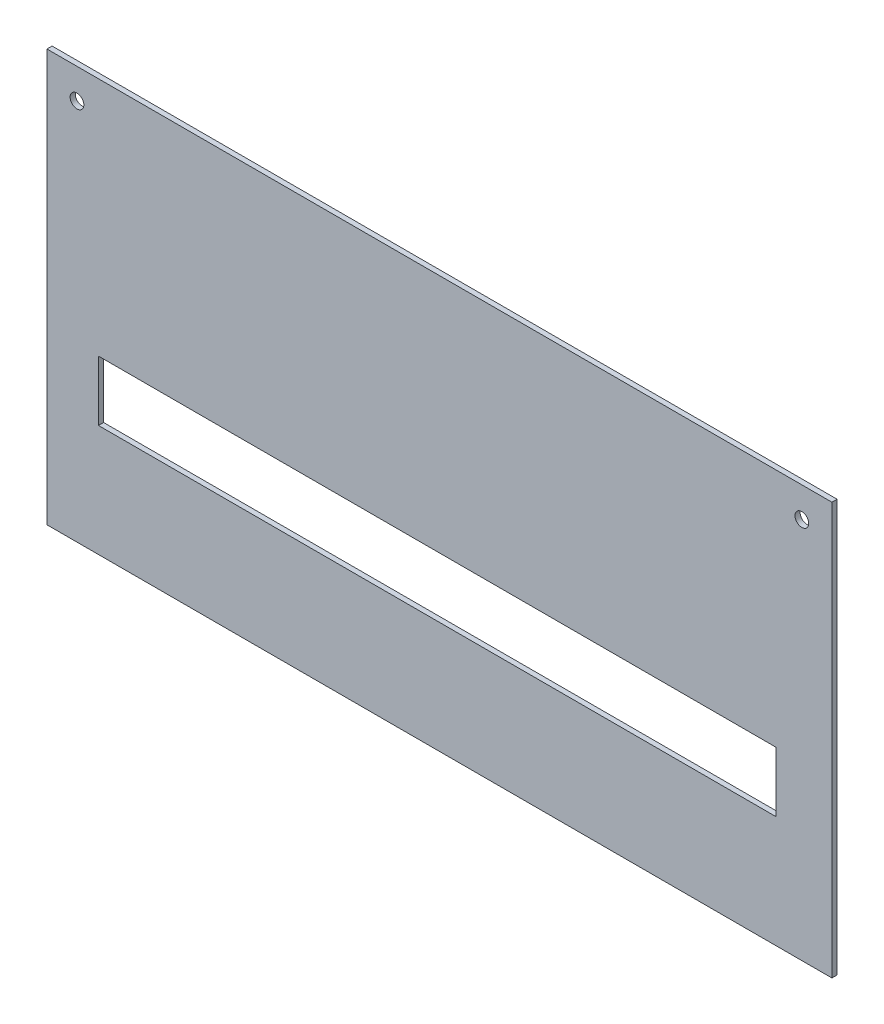
ISO-10303-21;
HEADER;
FILE_DESCRIPTION(('STEP AP214'),'2;1');
FILE_NAME('part.step','',(''),(''),'','','');
FILE_SCHEMA(('AUTOMOTIVE_DESIGN { 1 0 10303 214 1 1 1 1 }'));
ENDSEC;
DATA;
#1=APPLICATION_CONTEXT('core data for automotive mechanical design processes');
#2=APPLICATION_PROTOCOL_DEFINITION('international standard','automotive_design',2000,#1);
#3=PRODUCT_CONTEXT('',#1,'mechanical');
#4=PRODUCT('Part','Part','',(#3));
#5=PRODUCT_RELATED_PRODUCT_CATEGORY('part','',(#4));
#6=PRODUCT_DEFINITION_FORMATION('','',#4);
#7=PRODUCT_DEFINITION_CONTEXT('part definition',#1,'design');
#8=PRODUCT_DEFINITION('design','',#6,#7);
#9=PRODUCT_DEFINITION_SHAPE('','',#8);
#10=(LENGTH_UNIT() NAMED_UNIT(*) SI_UNIT(.MILLI.,.METRE.));
#11=(NAMED_UNIT(*) PLANE_ANGLE_UNIT() SI_UNIT($,.RADIAN.));
#12=(NAMED_UNIT(*) SI_UNIT($,.STERADIAN.) SOLID_ANGLE_UNIT());
#13=UNCERTAINTY_MEASURE_WITH_UNIT(LENGTH_MEASURE(1.E-05),#10,'distance_accuracy_value','');
#14=(GEOMETRIC_REPRESENTATION_CONTEXT(3) GLOBAL_UNCERTAINTY_ASSIGNED_CONTEXT((#13)) GLOBAL_UNIT_ASSIGNED_CONTEXT((#10,
#11,#12)) REPRESENTATION_CONTEXT('',''));
#15=CARTESIAN_POINT('',(0.,0.,0.));
#16=DIRECTION('',(0.,0.,1.));
#17=DIRECTION('',(1.,0.,0.));
#18=AXIS2_PLACEMENT_3D('',#15,#16,#17);
#19=CARTESIAN_POINT('',(228.6,120.,3.));
#20=DIRECTION('',(-1.,0.,0.));
#21=DIRECTION('',(0.,-1.,0.));
#22=AXIS2_PLACEMENT_3D('',#19,#20,#21);
#23=PLANE('',#22);
#24=DIRECTION('',(0.,1.,0.));
#25=VECTOR('',#24,1.);
#26=CARTESIAN_POINT('',(228.6,120.,0.));
#27=LINE('',#26,#25);
#28=CARTESIAN_POINT('',(228.6,-120.,0.));
#29=VERTEX_POINT('',#28);
#30=CARTESIAN_POINT('',(228.6,120.,0.));
#31=VERTEX_POINT('',#30);
#32=EDGE_CURVE('E142',#29,#31,#27,.T.);
#33=ORIENTED_EDGE('',*,*,#32,.T.);
#34=DIRECTION('',(0.,0.,-1.));
#35=VECTOR('',#34,1.);
#36=CARTESIAN_POINT('',(228.6,120.,3.));
#37=LINE('',#36,#35);
#38=CARTESIAN_POINT('',(228.6,120.,3.));
#39=VERTEX_POINT('',#38);
#40=EDGE_CURVE('E11',#39,#31,#37,.T.);
#41=ORIENTED_EDGE('',*,*,#40,.F.);
#42=DIRECTION('',(0.,1.,0.));
#43=VECTOR('',#42,1.);
#44=CARTESIAN_POINT('',(228.6,120.,3.));
#45=LINE('',#44,#43);
#46=CARTESIAN_POINT('',(228.6,-120.,3.));
#47=VERTEX_POINT('',#46);
#48=EDGE_CURVE('E145',#47,#39,#45,.T.);
#49=ORIENTED_EDGE('',*,*,#48,.F.);
#50=DIRECTION('',(0.,0.,-1.));
#51=VECTOR('',#50,1.);
#52=CARTESIAN_POINT('',(228.6,-120.,3.));
#53=LINE('',#52,#51);
#54=EDGE_CURVE('E155',#47,#29,#53,.T.);
#55=ORIENTED_EDGE('',*,*,#54,.T.);
#56=EDGE_LOOP('',(#33,#41,#49,#55));
#57=FACE_BOUND('',#56,.T.);
#58=ADVANCED_FACE('F32',(#57),#23,.F.);
#59=CARTESIAN_POINT('',(-228.6,120.,3.));
#60=DIRECTION('',(0.,-1.,0.));
#61=DIRECTION('',(0.,0.,-1.));
#62=AXIS2_PLACEMENT_3D('',#59,#60,#61);
#63=PLANE('',#62);
#64=DIRECTION('',(-1.,0.,0.));
#65=VECTOR('',#64,1.);
#66=CARTESIAN_POINT('',(-228.6,120.,0.));
#67=LINE('',#66,#65);
#68=CARTESIAN_POINT('',(-228.6,120.,0.));
#69=VERTEX_POINT('',#68);
#70=EDGE_CURVE('E158',#31,#69,#67,.T.);
#71=ORIENTED_EDGE('',*,*,#70,.T.);
#72=DIRECTION('',(0.,0.,-1.));
#73=VECTOR('',#72,1.);
#74=CARTESIAN_POINT('',(-228.6,120.,3.));
#75=LINE('',#74,#73);
#76=CARTESIAN_POINT('',(-228.6,120.,3.));
#77=VERTEX_POINT('',#76);
#78=EDGE_CURVE('E39',#77,#69,#75,.T.);
#79=ORIENTED_EDGE('',*,*,#78,.F.);
#80=DIRECTION('',(-1.,0.,0.));
#81=VECTOR('',#80,1.);
#82=CARTESIAN_POINT('',(-228.6,120.,3.));
#83=LINE('',#82,#81);
#84=EDGE_CURVE('E148',#39,#77,#83,.T.);
#85=ORIENTED_EDGE('',*,*,#84,.F.);
#86=ORIENTED_EDGE('',*,*,#40,.T.);
#87=EDGE_LOOP('',(#71,#79,#85,#86));
#88=FACE_BOUND('',#87,.T.);
#89=ADVANCED_FACE('F187',(#88),#63,.F.);
#90=CARTESIAN_POINT('',(-228.6,120.,3.));
#91=DIRECTION('',(1.,0.,0.));
#92=DIRECTION('',(0.,1.,0.));
#93=AXIS2_PLACEMENT_3D('',#90,#91,#92);
#94=PLANE('',#93);
#95=DIRECTION('',(0.,-1.,0.));
#96=VECTOR('',#95,1.);
#97=CARTESIAN_POINT('',(-228.6,120.,0.));
#98=LINE('',#97,#96);
#99=CARTESIAN_POINT('',(-228.6,-120.,0.));
#100=VERTEX_POINT('',#99);
#101=EDGE_CURVE('E160',#69,#100,#98,.T.);
#102=ORIENTED_EDGE('',*,*,#101,.T.);
#103=DIRECTION('',(0.,0.,-1.));
#104=VECTOR('',#103,1.);
#105=CARTESIAN_POINT('',(-228.6,-120.,3.));
#106=LINE('',#105,#104);
#107=CARTESIAN_POINT('',(-228.6,-120.,3.));
#108=VERTEX_POINT('',#107);
#109=EDGE_CURVE('E165',#108,#100,#106,.T.);
#110=ORIENTED_EDGE('',*,*,#109,.F.);
#111=DIRECTION('',(0.,-1.,0.));
#112=VECTOR('',#111,1.);
#113=CARTESIAN_POINT('',(-228.6,120.,3.));
#114=LINE('',#113,#112);
#115=EDGE_CURVE('E151',#77,#108,#114,.T.);
#116=ORIENTED_EDGE('',*,*,#115,.F.);
#117=ORIENTED_EDGE('',*,*,#78,.T.);
#118=EDGE_LOOP('',(#102,#110,#116,#117));
#119=FACE_BOUND('',#118,.T.);
#120=ADVANCED_FACE('F172',(#119),#94,.F.);
#121=CARTESIAN_POINT('',(-228.6,-120.,3.));
#122=DIRECTION('',(0.,1.,0.));
#123=DIRECTION('',(0.,0.,1.));
#124=AXIS2_PLACEMENT_3D('',#121,#122,#123);
#125=PLANE('',#124);
#126=DIRECTION('',(1.,0.,0.));
#127=VECTOR('',#126,1.);
#128=CARTESIAN_POINT('',(-228.6,-120.,0.));
#129=LINE('',#128,#127);
#130=EDGE_CURVE('E149',#100,#29,#129,.T.);
#131=ORIENTED_EDGE('',*,*,#130,.T.);
#132=ORIENTED_EDGE('',*,*,#54,.F.);
#133=DIRECTION('',(1.,0.,0.));
#134=VECTOR('',#133,1.);
#135=CARTESIAN_POINT('',(-228.6,-120.,3.));
#136=LINE('',#135,#134);
#137=EDGE_CURVE('E153',#108,#47,#136,.T.);
#138=ORIENTED_EDGE('',*,*,#137,.F.);
#139=ORIENTED_EDGE('',*,*,#109,.T.);
#140=EDGE_LOOP('',(#131,#132,#138,#139));
#141=FACE_BOUND('',#140,.T.);
#142=ADVANCED_FACE('F180',(#141),#125,.F.);
#143=CARTESIAN_POINT('',(0.,0.,3.));
#144=DIRECTION('',(0.,0.,1.));
#145=DIRECTION('',(1.,0.,0.));
#146=AXIS2_PLACEMENT_3D('',#143,#144,#145);
#147=PLANE('',#146);
#148=DIRECTION('',(0.,1.,0.));
#149=VECTOR('',#148,1.);
#150=CARTESIAN_POINT('',(196.1,-54.9,3.));
#151=LINE('',#150,#149);
#152=CARTESIAN_POINT('',(196.1,-54.9,3.));
#153=VERTEX_POINT('',#152);
#154=CARTESIAN_POINT('',(196.1,-19.9,3.));
#155=VERTEX_POINT('',#154);
#156=EDGE_CURVE('E46',#153,#155,#151,.T.);
#157=ORIENTED_EDGE('',*,*,#156,.F.);
#158=DIRECTION('',(1.,0.,0.));
#159=VECTOR('',#158,1.);
#160=CARTESIAN_POINT('',(-198.6,-54.9,3.));
#161=LINE('',#160,#159);
#162=CARTESIAN_POINT('',(-198.6,-54.9,3.));
#163=VERTEX_POINT('',#162);
#164=EDGE_CURVE('E114',#163,#153,#161,.T.);
#165=ORIENTED_EDGE('',*,*,#164,.F.);
#166=DIRECTION('',(0.,-1.,0.));
#167=VECTOR('',#166,1.);
#168=CARTESIAN_POINT('',(-198.6,-54.9,3.));
#169=LINE('',#168,#167);
#170=CARTESIAN_POINT('',(-198.6,-19.9,3.));
#171=VERTEX_POINT('',#170);
#172=EDGE_CURVE('E117',#171,#163,#169,.T.);
#173=ORIENTED_EDGE('',*,*,#172,.F.);
#174=DIRECTION('',(-1.,0.,0.));
#175=VECTOR('',#174,1.);
#176=CARTESIAN_POINT('',(-198.6,-19.9,3.));
#177=LINE('',#176,#175);
#178=EDGE_CURVE('E123',#155,#171,#177,.T.);
#179=ORIENTED_EDGE('',*,*,#178,.F.);
#180=EDGE_LOOP('',(#157,#165,#173,#179));
#181=FACE_BOUND('',#180,.T.);
#182=CARTESIAN_POINT('',(211.1,102.5,3.));
#183=DIRECTION('',(0.,0.,1.));
#184=DIRECTION('',(1.,0.,0.));
#185=AXIS2_PLACEMENT_3D('',#182,#183,#184);
#186=CIRCLE('',#185,3.99999999999999);
#187=CARTESIAN_POINT('',(215.1,102.5,3.));
#188=VERTEX_POINT('',#187);
#189=EDGE_CURVE('E129',#188,#188,#186,.T.);
#190=ORIENTED_EDGE('',*,*,#189,.F.);
#191=EDGE_LOOP('',(#190));
#192=FACE_BOUND('',#191,.T.);
#193=CARTESIAN_POINT('',(-211.1,102.5,3.));
#194=DIRECTION('',(0.,0.,1.));
#195=DIRECTION('',(1.,0.,0.));
#196=AXIS2_PLACEMENT_3D('',#193,#194,#195);
#197=CIRCLE('',#196,3.99999999999999);
#198=CARTESIAN_POINT('',(-207.1,102.5,3.));
#199=VERTEX_POINT('',#198);
#200=EDGE_CURVE('E136',#199,#199,#197,.T.);
#201=ORIENTED_EDGE('',*,*,#200,.F.);
#202=EDGE_LOOP('',(#201));
#203=FACE_BOUND('',#202,.T.);
#204=ORIENTED_EDGE('',*,*,#48,.T.);
#205=ORIENTED_EDGE('',*,*,#84,.T.);
#206=ORIENTED_EDGE('',*,*,#115,.T.);
#207=ORIENTED_EDGE('',*,*,#137,.T.);
#208=EDGE_LOOP('',(#204,#205,#206,#207));
#209=FACE_BOUND('',#208,.T.);
#210=ADVANCED_FACE('F186',(#181,#192,#203,#209),#147,.T.);
#211=CARTESIAN_POINT('',(0.,0.,0.));
#212=DIRECTION('',(0.,0.,1.));
#213=DIRECTION('',(1.,0.,0.));
#214=AXIS2_PLACEMENT_3D('',#211,#212,#213);
#215=PLANE('',#214);
#216=DIRECTION('',(1.,0.,0.));
#217=VECTOR('',#216,1.);
#218=CARTESIAN_POINT('',(-198.6,-54.9,0.));
#219=LINE('',#218,#217);
#220=CARTESIAN_POINT('',(-198.6,-54.9,0.));
#221=VERTEX_POINT('',#220);
#222=CARTESIAN_POINT('',(196.1,-54.9,0.));
#223=VERTEX_POINT('',#222);
#224=EDGE_CURVE('E104',#221,#223,#219,.T.);
#225=ORIENTED_EDGE('',*,*,#224,.T.);
#226=DIRECTION('',(0.,1.,0.));
#227=VECTOR('',#226,1.);
#228=CARTESIAN_POINT('',(196.1,-54.9,0.));
#229=LINE('',#228,#227);
#230=CARTESIAN_POINT('',(196.1,-19.9,0.));
#231=VERTEX_POINT('',#230);
#232=EDGE_CURVE('E98',#223,#231,#229,.T.);
#233=ORIENTED_EDGE('',*,*,#232,.T.);
#234=DIRECTION('',(-1.,0.,0.));
#235=VECTOR('',#234,1.);
#236=CARTESIAN_POINT('',(-198.6,-19.9,0.));
#237=LINE('',#236,#235);
#238=CARTESIAN_POINT('',(-198.6,-19.9,0.));
#239=VERTEX_POINT('',#238);
#240=EDGE_CURVE('E107',#231,#239,#237,.T.);
#241=ORIENTED_EDGE('',*,*,#240,.T.);
#242=DIRECTION('',(0.,-1.,0.));
#243=VECTOR('',#242,1.);
#244=CARTESIAN_POINT('',(-198.6,-54.9,0.));
#245=LINE('',#244,#243);
#246=EDGE_CURVE('E54',#239,#221,#245,.T.);
#247=ORIENTED_EDGE('',*,*,#246,.T.);
#248=EDGE_LOOP('',(#225,#233,#241,#247));
#249=FACE_BOUND('',#248,.T.);
#250=CARTESIAN_POINT('',(211.1,102.5,0.));
#251=DIRECTION('',(0.,0.,1.));
#252=DIRECTION('',(1.,0.,0.));
#253=AXIS2_PLACEMENT_3D('',#250,#251,#252);
#254=CIRCLE('',#253,3.99999999999999);
#255=CARTESIAN_POINT('',(215.1,102.5,0.));
#256=VERTEX_POINT('',#255);
#257=EDGE_CURVE('E133',#256,#256,#254,.T.);
#258=ORIENTED_EDGE('',*,*,#257,.T.);
#259=EDGE_LOOP('',(#258));
#260=FACE_BOUND('',#259,.T.);
#261=CARTESIAN_POINT('',(-211.1,102.5,0.));
#262=DIRECTION('',(0.,0.,1.));
#263=DIRECTION('',(1.,0.,0.));
#264=AXIS2_PLACEMENT_3D('',#261,#262,#263);
#265=CIRCLE('',#264,3.99999999999999);
#266=CARTESIAN_POINT('',(-207.1,102.5,0.));
#267=VERTEX_POINT('',#266);
#268=EDGE_CURVE('E139',#267,#267,#265,.T.);
#269=ORIENTED_EDGE('',*,*,#268,.T.);
#270=EDGE_LOOP('',(#269));
#271=FACE_BOUND('',#270,.T.);
#272=ORIENTED_EDGE('',*,*,#32,.F.);
#273=ORIENTED_EDGE('',*,*,#130,.F.);
#274=ORIENTED_EDGE('',*,*,#101,.F.);
#275=ORIENTED_EDGE('',*,*,#70,.F.);
#276=EDGE_LOOP('',(#272,#273,#274,#275));
#277=FACE_BOUND('',#276,.T.);
#278=ADVANCED_FACE('F111',(#249,#260,#271,#277),#215,.F.);
#279=CARTESIAN_POINT('',(-211.1,102.5,0.));
#280=DIRECTION('',(0.,0.,1.));
#281=DIRECTION('',(1.,0.,0.));
#282=AXIS2_PLACEMENT_3D('',#279,#280,#281);
#283=CYLINDRICAL_SURFACE('',#282,3.99999999999999);
#284=ORIENTED_EDGE('',*,*,#268,.F.);
#285=EDGE_LOOP('',(#284));
#286=FACE_BOUND('',#285,.T.);
#287=ORIENTED_EDGE('',*,*,#200,.T.);
#288=EDGE_LOOP('',(#287));
#289=FACE_BOUND('',#288,.T.);
#290=ADVANCED_FACE('F199',(#286,#289),#283,.F.);
#291=CARTESIAN_POINT('',(211.1,102.5,0.));
#292=DIRECTION('',(0.,0.,1.));
#293=DIRECTION('',(1.,0.,0.));
#294=AXIS2_PLACEMENT_3D('',#291,#292,#293);
#295=CYLINDRICAL_SURFACE('',#294,3.99999999999999);
#296=ORIENTED_EDGE('',*,*,#257,.F.);
#297=EDGE_LOOP('',(#296));
#298=FACE_BOUND('',#297,.T.);
#299=ORIENTED_EDGE('',*,*,#189,.T.);
#300=EDGE_LOOP('',(#299));
#301=FACE_BOUND('',#300,.T.);
#302=ADVANCED_FACE('F205',(#298,#301),#295,.F.);
#303=CARTESIAN_POINT('',(196.1,-54.9,0.));
#304=DIRECTION('',(1.,0.,0.));
#305=DIRECTION('',(0.,0.,-1.));
#306=AXIS2_PLACEMENT_3D('',#303,#304,#305);
#307=PLANE('',#306);
#308=ORIENTED_EDGE('',*,*,#156,.T.);
#309=DIRECTION('',(0.,0.,1.));
#310=VECTOR('',#309,1.);
#311=CARTESIAN_POINT('',(196.1,-19.9,0.));
#312=LINE('',#311,#310);
#313=EDGE_CURVE('E94',#231,#155,#312,.T.);
#314=ORIENTED_EDGE('',*,*,#313,.F.);
#315=ORIENTED_EDGE('',*,*,#232,.F.);
#316=DIRECTION('',(0.,0.,1.));
#317=VECTOR('',#316,1.);
#318=CARTESIAN_POINT('',(196.1,-54.9,0.));
#319=LINE('',#318,#317);
#320=EDGE_CURVE('E127',#223,#153,#319,.T.);
#321=ORIENTED_EDGE('',*,*,#320,.T.);
#322=EDGE_LOOP('',(#308,#314,#315,#321));
#323=FACE_BOUND('',#322,.T.);
#324=ADVANCED_FACE('F96',(#323),#307,.F.);
#325=CARTESIAN_POINT('',(-198.6,-54.9,0.));
#326=DIRECTION('',(0.,-1.,0.));
#327=DIRECTION('',(0.,0.,-1.));
#328=AXIS2_PLACEMENT_3D('',#325,#326,#327);
#329=PLANE('',#328);
#330=ORIENTED_EDGE('',*,*,#164,.T.);
#331=ORIENTED_EDGE('',*,*,#320,.F.);
#332=ORIENTED_EDGE('',*,*,#224,.F.);
#333=DIRECTION('',(0.,0.,1.));
#334=VECTOR('',#333,1.);
#335=CARTESIAN_POINT('',(-198.6,-54.9,0.));
#336=LINE('',#335,#334);
#337=EDGE_CURVE('E130',#221,#163,#336,.T.);
#338=ORIENTED_EDGE('',*,*,#337,.T.);
#339=EDGE_LOOP('',(#330,#331,#332,#338));
#340=FACE_BOUND('',#339,.T.);
#341=ADVANCED_FACE('F212',(#340),#329,.F.);
#342=CARTESIAN_POINT('',(-198.6,-54.9,0.));
#343=DIRECTION('',(-1.,0.,0.));
#344=DIRECTION('',(0.,0.,1.));
#345=AXIS2_PLACEMENT_3D('',#342,#343,#344);
#346=PLANE('',#345);
#347=ORIENTED_EDGE('',*,*,#172,.T.);
#348=ORIENTED_EDGE('',*,*,#337,.F.);
#349=ORIENTED_EDGE('',*,*,#246,.F.);
#350=DIRECTION('',(0.,0.,1.));
#351=VECTOR('',#350,1.);
#352=CARTESIAN_POINT('',(-198.6,-19.9,0.));
#353=LINE('',#352,#351);
#354=EDGE_CURVE('E103',#239,#171,#353,.T.);
#355=ORIENTED_EDGE('',*,*,#354,.T.);
#356=EDGE_LOOP('',(#347,#348,#349,#355));
#357=FACE_BOUND('',#356,.T.);
#358=ADVANCED_FACE('F215',(#357),#346,.F.);
#359=CARTESIAN_POINT('',(-198.6,-19.9,0.));
#360=DIRECTION('',(0.,1.,0.));
#361=DIRECTION('',(0.,0.,1.));
#362=AXIS2_PLACEMENT_3D('',#359,#360,#361);
#363=PLANE('',#362);
#364=ORIENTED_EDGE('',*,*,#178,.T.);
#365=ORIENTED_EDGE('',*,*,#354,.F.);
#366=ORIENTED_EDGE('',*,*,#240,.F.);
#367=ORIENTED_EDGE('',*,*,#313,.T.);
#368=EDGE_LOOP('',(#364,#365,#366,#367));
#369=FACE_BOUND('',#368,.T.);
#370=ADVANCED_FACE('F108',(#369),#363,.F.);
#371=CLOSED_SHELL('',(#58,#89,#120,#142,#210,#278,#290,#302,#324,#341,#358,#370));
#372=MANIFOLD_SOLID_BREP('B2',#371);
#373=ADVANCED_BREP_SHAPE_REPRESENTATION('',(#18,#372),#14);
#374=SHAPE_DEFINITION_REPRESENTATION(#9,#373);
ENDSEC;
END-ISO-10303-21;
